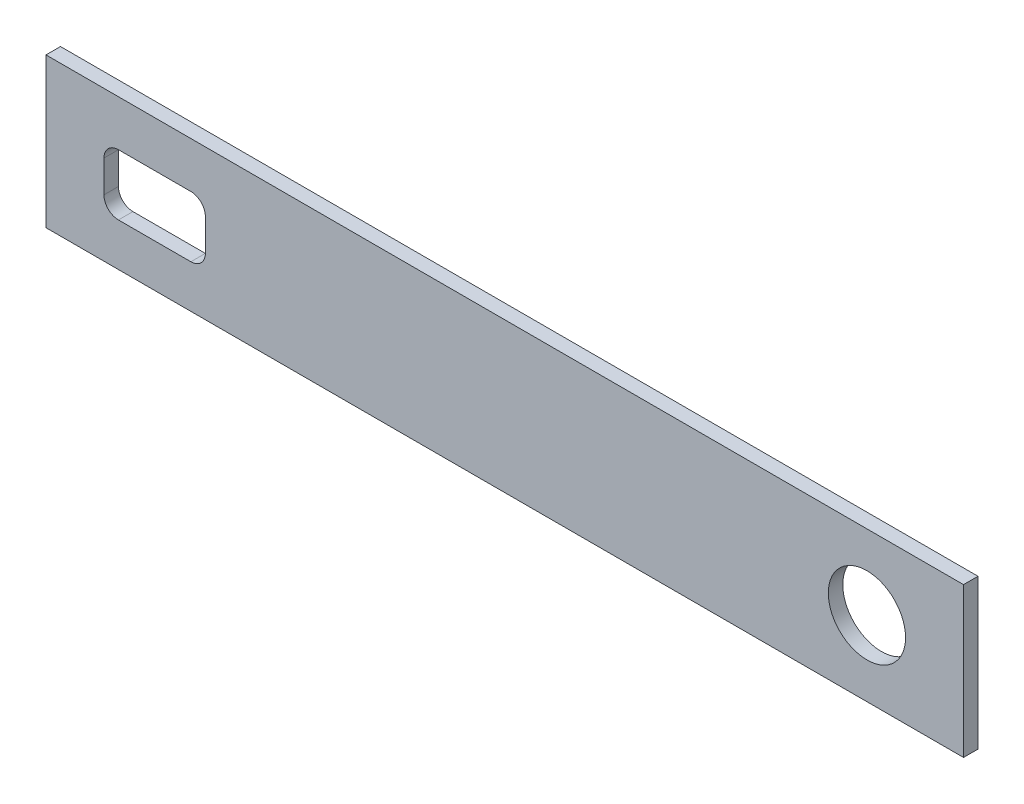
ISO-10303-21;
HEADER;
FILE_DESCRIPTION(('STEP AP214'),'2;1');
FILE_NAME('part.step','',(''),(''),'','','');
FILE_SCHEMA(('AUTOMOTIVE_DESIGN { 1 0 10303 214 1 1 1 1 }'));
ENDSEC;
DATA;
#1=APPLICATION_CONTEXT('core data for automotive mechanical design processes');
#2=APPLICATION_PROTOCOL_DEFINITION('international standard','automotive_design',2000,#1);
#3=PRODUCT_CONTEXT('',#1,'mechanical');
#4=PRODUCT('Part','Part','',(#3));
#5=PRODUCT_RELATED_PRODUCT_CATEGORY('part','',(#4));
#6=PRODUCT_DEFINITION_FORMATION('','',#4);
#7=PRODUCT_DEFINITION_CONTEXT('part definition',#1,'design');
#8=PRODUCT_DEFINITION('design','',#6,#7);
#9=PRODUCT_DEFINITION_SHAPE('','',#8);
#10=(LENGTH_UNIT() NAMED_UNIT(*) SI_UNIT(.MILLI.,.METRE.));
#11=(NAMED_UNIT(*) PLANE_ANGLE_UNIT() SI_UNIT($,.RADIAN.));
#12=(NAMED_UNIT(*) SI_UNIT($,.STERADIAN.) SOLID_ANGLE_UNIT());
#13=UNCERTAINTY_MEASURE_WITH_UNIT(LENGTH_MEASURE(1.E-05),#10,'distance_accuracy_value','');
#14=(GEOMETRIC_REPRESENTATION_CONTEXT(3) GLOBAL_UNCERTAINTY_ASSIGNED_CONTEXT((#13)) GLOBAL_UNIT_ASSIGNED_CONTEXT((#10,
#11,#12)) REPRESENTATION_CONTEXT('',''));
#15=CARTESIAN_POINT('',(0.,0.,0.));
#16=DIRECTION('',(0.,0.,1.));
#17=DIRECTION('',(1.,0.,0.));
#18=AXIS2_PLACEMENT_3D('',#15,#16,#17);
#19=CARTESIAN_POINT('',(0.,0.,-3.));
#20=DIRECTION('',(-1.,0.,0.));
#21=DIRECTION('',(0.,0.,1.));
#22=AXIS2_PLACEMENT_3D('',#19,#20,#21);
#23=PLANE('',#22);
#24=DIRECTION('',(0.,-1.,0.));
#25=VECTOR('',#24,1.);
#26=CARTESIAN_POINT('',(0.,0.,0.));
#27=LINE('',#26,#25);
#28=CARTESIAN_POINT('',(0.,31.,0.));
#29=VERTEX_POINT('',#28);
#30=CARTESIAN_POINT('',(0.,0.,0.));
#31=VERTEX_POINT('',#30);
#32=EDGE_CURVE('E196',#29,#31,#27,.T.);
#33=ORIENTED_EDGE('',*,*,#32,.F.);
#34=DIRECTION('',(0.,0.,1.));
#35=VECTOR('',#34,1.);
#36=CARTESIAN_POINT('',(0.,31.,-3.));
#37=LINE('',#36,#35);
#38=CARTESIAN_POINT('',(0.,31.,-3.));
#39=VERTEX_POINT('',#38);
#40=EDGE_CURVE('E11',#39,#29,#37,.T.);
#41=ORIENTED_EDGE('',*,*,#40,.F.);
#42=DIRECTION('',(0.,-1.,0.));
#43=VECTOR('',#42,1.);
#44=CARTESIAN_POINT('',(0.,0.,-3.));
#45=LINE('',#44,#43);
#46=CARTESIAN_POINT('',(0.,0.,-3.));
#47=VERTEX_POINT('',#46);
#48=EDGE_CURVE('E199',#39,#47,#45,.T.);
#49=ORIENTED_EDGE('',*,*,#48,.T.);
#50=DIRECTION('',(0.,0.,1.));
#51=VECTOR('',#50,1.);
#52=CARTESIAN_POINT('',(0.,0.,-3.));
#53=LINE('',#52,#51);
#54=EDGE_CURVE('E38',#47,#31,#53,.T.);
#55=ORIENTED_EDGE('',*,*,#54,.T.);
#56=EDGE_LOOP('',(#33,#41,#49,#55));
#57=FACE_BOUND('',#56,.T.);
#58=ADVANCED_FACE('F35',(#57),#23,.T.);
#59=CARTESIAN_POINT('',(0.,31.,-3.));
#60=DIRECTION('',(0.,1.,0.));
#61=DIRECTION('',(0.,0.,1.));
#62=AXIS2_PLACEMENT_3D('',#59,#60,#61);
#63=PLANE('',#62);
#64=DIRECTION('',(-1.,0.,0.));
#65=VECTOR('',#64,1.);
#66=CARTESIAN_POINT('',(0.,31.,0.));
#67=LINE('',#66,#65);
#68=CARTESIAN_POINT('',(190.,31.,0.));
#69=VERTEX_POINT('',#68);
#70=EDGE_CURVE('E203',#69,#29,#67,.T.);
#71=ORIENTED_EDGE('',*,*,#70,.F.);
#72=DIRECTION('',(0.,0.,1.));
#73=VECTOR('',#72,1.);
#74=CARTESIAN_POINT('',(190.,31.,-3.));
#75=LINE('',#74,#73);
#76=CARTESIAN_POINT('',(190.,31.,-3.));
#77=VERTEX_POINT('',#76);
#78=EDGE_CURVE('E43',#77,#69,#75,.T.);
#79=ORIENTED_EDGE('',*,*,#78,.F.);
#80=DIRECTION('',(-1.,0.,0.));
#81=VECTOR('',#80,1.);
#82=CARTESIAN_POINT('',(0.,31.,-3.));
#83=LINE('',#82,#81);
#84=EDGE_CURVE('E209',#77,#39,#83,.T.);
#85=ORIENTED_EDGE('',*,*,#84,.T.);
#86=ORIENTED_EDGE('',*,*,#40,.T.);
#87=EDGE_LOOP('',(#71,#79,#85,#86));
#88=FACE_BOUND('',#87,.T.);
#89=ADVANCED_FACE('F235',(#88),#63,.T.);
#90=CARTESIAN_POINT('',(190.,0.,-3.));
#91=DIRECTION('',(1.,0.,0.));
#92=DIRECTION('',(0.,0.,-1.));
#93=AXIS2_PLACEMENT_3D('',#90,#91,#92);
#94=PLANE('',#93);
#95=DIRECTION('',(0.,1.,0.));
#96=VECTOR('',#95,1.);
#97=CARTESIAN_POINT('',(190.,0.,0.));
#98=LINE('',#97,#96);
#99=CARTESIAN_POINT('',(190.,0.,0.));
#100=VERTEX_POINT('',#99);
#101=EDGE_CURVE('E217',#100,#69,#98,.T.);
#102=ORIENTED_EDGE('',*,*,#101,.F.);
#103=DIRECTION('',(0.,0.,1.));
#104=VECTOR('',#103,1.);
#105=CARTESIAN_POINT('',(190.,0.,-3.));
#106=LINE('',#105,#104);
#107=CARTESIAN_POINT('',(190.,0.,-3.));
#108=VERTEX_POINT('',#107);
#109=EDGE_CURVE('E222',#108,#100,#106,.T.);
#110=ORIENTED_EDGE('',*,*,#109,.F.);
#111=DIRECTION('',(0.,1.,0.));
#112=VECTOR('',#111,1.);
#113=CARTESIAN_POINT('',(190.,0.,-3.));
#114=LINE('',#113,#112);
#115=EDGE_CURVE('E206',#108,#77,#114,.T.);
#116=ORIENTED_EDGE('',*,*,#115,.T.);
#117=ORIENTED_EDGE('',*,*,#78,.T.);
#118=EDGE_LOOP('',(#102,#110,#116,#117));
#119=FACE_BOUND('',#118,.T.);
#120=ADVANCED_FACE('F240',(#119),#94,.T.);
#121=CARTESIAN_POINT('',(0.,0.,-3.));
#122=DIRECTION('',(0.,-1.,0.));
#123=DIRECTION('',(0.,0.,-1.));
#124=AXIS2_PLACEMENT_3D('',#121,#122,#123);
#125=PLANE('',#124);
#126=DIRECTION('',(1.,0.,0.));
#127=VECTOR('',#126,1.);
#128=CARTESIAN_POINT('',(0.,0.,0.));
#129=LINE('',#128,#127);
#130=EDGE_CURVE('E214',#31,#100,#129,.T.);
#131=ORIENTED_EDGE('',*,*,#130,.F.);
#132=ORIENTED_EDGE('',*,*,#54,.F.);
#133=DIRECTION('',(1.,0.,0.));
#134=VECTOR('',#133,1.);
#135=CARTESIAN_POINT('',(0.,0.,-3.));
#136=LINE('',#135,#134);
#137=EDGE_CURVE('E202',#47,#108,#136,.T.);
#138=ORIENTED_EDGE('',*,*,#137,.T.);
#139=ORIENTED_EDGE('',*,*,#109,.T.);
#140=EDGE_LOOP('',(#131,#132,#138,#139));
#141=FACE_BOUND('',#140,.T.);
#142=ADVANCED_FACE('F230',(#141),#125,.T.);
#143=CARTESIAN_POINT('',(0.,0.,-3.));
#144=DIRECTION('',(0.,0.,-1.));
#145=DIRECTION('',(-1.,0.,0.));
#146=AXIS2_PLACEMENT_3D('',#143,#144,#145);
#147=PLANE('',#146);
#148=CARTESIAN_POINT('',(30.,11.9,-3.));
#149=DIRECTION('',(0.,0.,1.));
#150=DIRECTION('',(1.,0.,0.));
#151=AXIS2_PLACEMENT_3D('',#148,#149,#150);
#152=CIRCLE('',#151,3.);
#153=CARTESIAN_POINT('',(30.,8.9,-3.));
#154=VERTEX_POINT('',#153);
#155=CARTESIAN_POINT('',(33.,11.9,-3.));
#156=VERTEX_POINT('',#155);
#157=EDGE_CURVE('E126',#154,#156,#152,.T.);
#158=ORIENTED_EDGE('',*,*,#157,.T.);
#159=DIRECTION('',(0.,1.,0.));
#160=VECTOR('',#159,1.);
#161=CARTESIAN_POINT('',(33.,18.5,-3.));
#162=LINE('',#161,#160);
#163=CARTESIAN_POINT('',(33.,18.5,-3.));
#164=VERTEX_POINT('',#163);
#165=EDGE_CURVE('E135',#156,#164,#162,.T.);
#166=ORIENTED_EDGE('',*,*,#165,.T.);
#167=CARTESIAN_POINT('',(30.,18.5,-3.));
#168=DIRECTION('',(0.,0.,1.));
#169=DIRECTION('',(-1.,0.,0.));
#170=AXIS2_PLACEMENT_3D('',#167,#168,#169);
#171=CIRCLE('',#170,3.);
#172=CARTESIAN_POINT('',(30.,21.5,-3.));
#173=VERTEX_POINT('',#172);
#174=EDGE_CURVE('E51',#164,#173,#171,.T.);
#175=ORIENTED_EDGE('',*,*,#174,.T.);
#176=DIRECTION('',(-1.,0.,0.));
#177=VECTOR('',#176,1.);
#178=CARTESIAN_POINT('',(15.,21.5,-3.));
#179=LINE('',#178,#177);
#180=CARTESIAN_POINT('',(15.,21.5,-3.));
#181=VERTEX_POINT('',#180);
#182=EDGE_CURVE('E150',#173,#181,#179,.T.);
#183=ORIENTED_EDGE('',*,*,#182,.T.);
#184=CARTESIAN_POINT('',(15.,18.5,-3.));
#185=DIRECTION('',(0.,0.,1.));
#186=DIRECTION('',(1.,0.,0.));
#187=AXIS2_PLACEMENT_3D('',#184,#185,#186);
#188=CIRCLE('',#187,3.);
#189=CARTESIAN_POINT('',(12.,18.5,-3.));
#190=VERTEX_POINT('',#189);
#191=EDGE_CURVE('E153',#181,#190,#188,.T.);
#192=ORIENTED_EDGE('',*,*,#191,.T.);
#193=DIRECTION('',(0.,-1.,0.));
#194=VECTOR('',#193,1.);
#195=CARTESIAN_POINT('',(12.,18.5,-3.));
#196=LINE('',#195,#194);
#197=CARTESIAN_POINT('',(12.,11.9,-3.));
#198=VERTEX_POINT('',#197);
#199=EDGE_CURVE('E156',#190,#198,#196,.T.);
#200=ORIENTED_EDGE('',*,*,#199,.T.);
#201=CARTESIAN_POINT('',(15.,11.9,-3.));
#202=DIRECTION('',(0.,0.,1.));
#203=DIRECTION('',(1.,0.,0.));
#204=AXIS2_PLACEMENT_3D('',#201,#202,#203);
#205=CIRCLE('',#204,3.);
#206=CARTESIAN_POINT('',(15.,8.9,-3.));
#207=VERTEX_POINT('',#206);
#208=EDGE_CURVE('E159',#198,#207,#205,.T.);
#209=ORIENTED_EDGE('',*,*,#208,.T.);
#210=DIRECTION('',(1.,0.,0.));
#211=VECTOR('',#210,1.);
#212=CARTESIAN_POINT('',(15.,8.9,-3.));
#213=LINE('',#212,#211);
#214=EDGE_CURVE('E132',#207,#154,#213,.T.);
#215=ORIENTED_EDGE('',*,*,#214,.T.);
#216=EDGE_LOOP('',(#158,#166,#175,#183,#192,#200,#209,#215));
#217=FACE_BOUND('',#216,.T.);
#218=CARTESIAN_POINT('',(170.,15.5,-3.));
#219=DIRECTION('',(0.,0.,1.));
#220=DIRECTION('',(1.,0.,0.));
#221=AXIS2_PLACEMENT_3D('',#218,#219,#220);
#222=CIRCLE('',#221,8.00000000000001);
#223=CARTESIAN_POINT('',(178.,15.5,-3.));
#224=VERTEX_POINT('',#223);
#225=EDGE_CURVE('E193',#224,#224,#222,.T.);
#226=ORIENTED_EDGE('',*,*,#225,.T.);
#227=EDGE_LOOP('',(#226));
#228=FACE_BOUND('',#227,.T.);
#229=ORIENTED_EDGE('',*,*,#48,.F.);
#230=ORIENTED_EDGE('',*,*,#84,.F.);
#231=ORIENTED_EDGE('',*,*,#115,.F.);
#232=ORIENTED_EDGE('',*,*,#137,.F.);
#233=EDGE_LOOP('',(#229,#230,#231,#232));
#234=FACE_BOUND('',#233,.T.);
#235=ADVANCED_FACE('F139',(#217,#228,#234),#147,.T.);
#236=CARTESIAN_POINT('',(0.,0.,0.));
#237=DIRECTION('',(0.,0.,-1.));
#238=DIRECTION('',(-1.,0.,0.));
#239=AXIS2_PLACEMENT_3D('',#236,#237,#238);
#240=PLANE('',#239);
#241=DIRECTION('',(0.,1.,0.));
#242=VECTOR('',#241,1.);
#243=CARTESIAN_POINT('',(33.,18.5,0.));
#244=LINE('',#243,#242);
#245=CARTESIAN_POINT('',(33.,11.9,0.));
#246=VERTEX_POINT('',#245);
#247=CARTESIAN_POINT('',(33.,18.5,0.));
#248=VERTEX_POINT('',#247);
#249=EDGE_CURVE('E163',#246,#248,#244,.T.);
#250=ORIENTED_EDGE('',*,*,#249,.F.);
#251=CARTESIAN_POINT('',(30.,11.9,0.));
#252=DIRECTION('',(0.,0.,1.));
#253=DIRECTION('',(1.,0.,0.));
#254=AXIS2_PLACEMENT_3D('',#251,#252,#253);
#255=CIRCLE('',#254,3.);
#256=CARTESIAN_POINT('',(30.,8.9,0.));
#257=VERTEX_POINT('',#256);
#258=EDGE_CURVE('E59',#257,#246,#255,.T.);
#259=ORIENTED_EDGE('',*,*,#258,.F.);
#260=DIRECTION('',(1.,0.,0.));
#261=VECTOR('',#260,1.);
#262=CARTESIAN_POINT('',(15.,8.9,0.));
#263=LINE('',#262,#261);
#264=CARTESIAN_POINT('',(15.,8.9,0.));
#265=VERTEX_POINT('',#264);
#266=EDGE_CURVE('E143',#265,#257,#263,.T.);
#267=ORIENTED_EDGE('',*,*,#266,.F.);
#268=CARTESIAN_POINT('',(15.,11.9,0.));
#269=DIRECTION('',(0.,0.,1.));
#270=DIRECTION('',(1.,0.,0.));
#271=AXIS2_PLACEMENT_3D('',#268,#269,#270);
#272=CIRCLE('',#271,3.);
#273=CARTESIAN_POINT('',(12.,11.9,0.));
#274=VERTEX_POINT('',#273);
#275=EDGE_CURVE('E146',#274,#265,#272,.T.);
#276=ORIENTED_EDGE('',*,*,#275,.F.);
#277=DIRECTION('',(0.,-1.,0.));
#278=VECTOR('',#277,1.);
#279=CARTESIAN_POINT('',(12.,18.5,0.));
#280=LINE('',#279,#278);
#281=CARTESIAN_POINT('',(12.,18.5,0.));
#282=VERTEX_POINT('',#281);
#283=EDGE_CURVE('E174',#282,#274,#280,.T.);
#284=ORIENTED_EDGE('',*,*,#283,.F.);
#285=CARTESIAN_POINT('',(15.,18.5,0.));
#286=DIRECTION('',(0.,0.,1.));
#287=DIRECTION('',(1.,0.,0.));
#288=AXIS2_PLACEMENT_3D('',#285,#286,#287);
#289=CIRCLE('',#288,3.);
#290=CARTESIAN_POINT('',(15.,21.5,0.));
#291=VERTEX_POINT('',#290);
#292=EDGE_CURVE('E171',#291,#282,#289,.T.);
#293=ORIENTED_EDGE('',*,*,#292,.F.);
#294=DIRECTION('',(-1.,0.,0.));
#295=VECTOR('',#294,1.);
#296=CARTESIAN_POINT('',(15.,21.5,0.));
#297=LINE('',#296,#295);
#298=CARTESIAN_POINT('',(30.,21.5,0.));
#299=VERTEX_POINT('',#298);
#300=EDGE_CURVE('E168',#299,#291,#297,.T.);
#301=ORIENTED_EDGE('',*,*,#300,.F.);
#302=CARTESIAN_POINT('',(30.,18.5,0.));
#303=DIRECTION('',(0.,0.,1.));
#304=DIRECTION('',(-1.,0.,0.));
#305=AXIS2_PLACEMENT_3D('',#302,#303,#304);
#306=CIRCLE('',#305,3.);
#307=EDGE_CURVE('E165',#248,#299,#306,.T.);
#308=ORIENTED_EDGE('',*,*,#307,.F.);
#309=EDGE_LOOP('',(#250,#259,#267,#276,#284,#293,#301,#308));
#310=FACE_BOUND('',#309,.T.);
#311=CARTESIAN_POINT('',(170.,15.5,0.));
#312=DIRECTION('',(0.,0.,1.));
#313=DIRECTION('',(1.,0.,0.));
#314=AXIS2_PLACEMENT_3D('',#311,#312,#313);
#315=CIRCLE('',#314,8.00000000000001);
#316=CARTESIAN_POINT('',(178.,15.5,0.));
#317=VERTEX_POINT('',#316);
#318=EDGE_CURVE('E181',#317,#317,#315,.T.);
#319=ORIENTED_EDGE('',*,*,#318,.F.);
#320=EDGE_LOOP('',(#319));
#321=FACE_BOUND('',#320,.T.);
#322=ORIENTED_EDGE('',*,*,#32,.T.);
#323=ORIENTED_EDGE('',*,*,#130,.T.);
#324=ORIENTED_EDGE('',*,*,#101,.T.);
#325=ORIENTED_EDGE('',*,*,#70,.T.);
#326=EDGE_LOOP('',(#322,#323,#324,#325));
#327=FACE_BOUND('',#326,.T.);
#328=ADVANCED_FACE('F232',(#310,#321,#327),#240,.F.);
#329=CARTESIAN_POINT('',(170.,15.5,-3.));
#330=DIRECTION('',(0.,0.,1.));
#331=DIRECTION('',(1.,0.,0.));
#332=AXIS2_PLACEMENT_3D('',#329,#330,#331);
#333=CYLINDRICAL_SURFACE('',#332,8.00000000000001);
#334=ORIENTED_EDGE('',*,*,#225,.F.);
#335=EDGE_LOOP('',(#334));
#336=FACE_BOUND('',#335,.T.);
#337=ORIENTED_EDGE('',*,*,#318,.T.);
#338=EDGE_LOOP('',(#337));
#339=FACE_BOUND('',#338,.T.);
#340=ADVANCED_FACE('F286',(#336,#339),#333,.F.);
#341=CARTESIAN_POINT('',(30.,11.9,-3.));
#342=DIRECTION('',(0.,0.,1.));
#343=DIRECTION('',(1.,0.,0.));
#344=AXIS2_PLACEMENT_3D('',#341,#342,#343);
#345=CYLINDRICAL_SURFACE('',#344,3.);
#346=ORIENTED_EDGE('',*,*,#258,.T.);
#347=DIRECTION('',(0.,0.,1.));
#348=VECTOR('',#347,1.);
#349=CARTESIAN_POINT('',(33.,11.9,-3.));
#350=LINE('',#349,#348);
#351=EDGE_CURVE('E122',#156,#246,#350,.T.);
#352=ORIENTED_EDGE('',*,*,#351,.F.);
#353=ORIENTED_EDGE('',*,*,#157,.F.);
#354=DIRECTION('',(0.,0.,1.));
#355=VECTOR('',#354,1.);
#356=CARTESIAN_POINT('',(30.,8.9,-3.));
#357=LINE('',#356,#355);
#358=EDGE_CURVE('E179',#154,#257,#357,.T.);
#359=ORIENTED_EDGE('',*,*,#358,.T.);
#360=EDGE_LOOP('',(#346,#352,#353,#359));
#361=FACE_BOUND('',#360,.T.);
#362=ADVANCED_FACE('F124',(#361),#345,.F.);
#363=CARTESIAN_POINT('',(15.,8.9,-3.));
#364=DIRECTION('',(0.,-1.,0.));
#365=DIRECTION('',(0.,0.,-1.));
#366=AXIS2_PLACEMENT_3D('',#363,#364,#365);
#367=PLANE('',#366);
#368=ORIENTED_EDGE('',*,*,#266,.T.);
#369=ORIENTED_EDGE('',*,*,#358,.F.);
#370=ORIENTED_EDGE('',*,*,#214,.F.);
#371=DIRECTION('',(0.,0.,1.));
#372=VECTOR('',#371,1.);
#373=CARTESIAN_POINT('',(15.,8.9,-3.));
#374=LINE('',#373,#372);
#375=EDGE_CURVE('E182',#207,#265,#374,.T.);
#376=ORIENTED_EDGE('',*,*,#375,.T.);
#377=EDGE_LOOP('',(#368,#369,#370,#376));
#378=FACE_BOUND('',#377,.T.);
#379=ADVANCED_FACE('F307',(#378),#367,.F.);
#380=CARTESIAN_POINT('',(15.,11.9,-3.));
#381=DIRECTION('',(0.,0.,1.));
#382=DIRECTION('',(1.,0.,0.));
#383=AXIS2_PLACEMENT_3D('',#380,#381,#382);
#384=CYLINDRICAL_SURFACE('',#383,3.);
#385=ORIENTED_EDGE('',*,*,#275,.T.);
#386=ORIENTED_EDGE('',*,*,#375,.F.);
#387=ORIENTED_EDGE('',*,*,#208,.F.);
#388=DIRECTION('',(0.,0.,1.));
#389=VECTOR('',#388,1.);
#390=CARTESIAN_POINT('',(12.,11.9,-3.));
#391=LINE('',#390,#389);
#392=EDGE_CURVE('E184',#198,#274,#391,.T.);
#393=ORIENTED_EDGE('',*,*,#392,.T.);
#394=EDGE_LOOP('',(#385,#386,#387,#393));
#395=FACE_BOUND('',#394,.T.);
#396=ADVANCED_FACE('F317',(#395),#384,.F.);
#397=CARTESIAN_POINT('',(12.,18.5,-3.));
#398=DIRECTION('',(-1.,0.,0.));
#399=DIRECTION('',(0.,-1.,0.));
#400=AXIS2_PLACEMENT_3D('',#397,#398,#399);
#401=PLANE('',#400);
#402=ORIENTED_EDGE('',*,*,#283,.T.);
#403=ORIENTED_EDGE('',*,*,#392,.F.);
#404=ORIENTED_EDGE('',*,*,#199,.F.);
#405=DIRECTION('',(0.,0.,1.));
#406=VECTOR('',#405,1.);
#407=CARTESIAN_POINT('',(12.,18.5,-3.));
#408=LINE('',#407,#406);
#409=EDGE_CURVE('E186',#190,#282,#408,.T.);
#410=ORIENTED_EDGE('',*,*,#409,.T.);
#411=EDGE_LOOP('',(#402,#403,#404,#410));
#412=FACE_BOUND('',#411,.T.);
#413=ADVANCED_FACE('F328',(#412),#401,.F.);
#414=CARTESIAN_POINT('',(15.,18.5,-3.));
#415=DIRECTION('',(0.,0.,1.));
#416=DIRECTION('',(1.,0.,0.));
#417=AXIS2_PLACEMENT_3D('',#414,#415,#416);
#418=CYLINDRICAL_SURFACE('',#417,3.);
#419=ORIENTED_EDGE('',*,*,#292,.T.);
#420=ORIENTED_EDGE('',*,*,#409,.F.);
#421=ORIENTED_EDGE('',*,*,#191,.F.);
#422=DIRECTION('',(0.,0.,1.));
#423=VECTOR('',#422,1.);
#424=CARTESIAN_POINT('',(15.,21.5,-3.));
#425=LINE('',#424,#423);
#426=EDGE_CURVE('E188',#181,#291,#425,.T.);
#427=ORIENTED_EDGE('',*,*,#426,.T.);
#428=EDGE_LOOP('',(#419,#420,#421,#427));
#429=FACE_BOUND('',#428,.T.);
#430=ADVANCED_FACE('F339',(#429),#418,.F.);
#431=CARTESIAN_POINT('',(15.,21.5,-3.));
#432=DIRECTION('',(0.,1.,0.));
#433=DIRECTION('',(0.,0.,1.));
#434=AXIS2_PLACEMENT_3D('',#431,#432,#433);
#435=PLANE('',#434);
#436=ORIENTED_EDGE('',*,*,#300,.T.);
#437=ORIENTED_EDGE('',*,*,#426,.F.);
#438=ORIENTED_EDGE('',*,*,#182,.F.);
#439=DIRECTION('',(0.,0.,1.));
#440=VECTOR('',#439,1.);
#441=CARTESIAN_POINT('',(30.,21.5,-3.));
#442=LINE('',#441,#440);
#443=EDGE_CURVE('E190',#173,#299,#442,.T.);
#444=ORIENTED_EDGE('',*,*,#443,.T.);
#445=EDGE_LOOP('',(#436,#437,#438,#444));
#446=FACE_BOUND('',#445,.T.);
#447=ADVANCED_FACE('F350',(#446),#435,.F.);
#448=CARTESIAN_POINT('',(30.,18.5,-3.));
#449=DIRECTION('',(0.,0.,1.));
#450=DIRECTION('',(1.,0.,0.));
#451=AXIS2_PLACEMENT_3D('',#448,#449,#450);
#452=CYLINDRICAL_SURFACE('',#451,3.);
#453=ORIENTED_EDGE('',*,*,#307,.T.);
#454=ORIENTED_EDGE('',*,*,#443,.F.);
#455=ORIENTED_EDGE('',*,*,#174,.F.);
#456=DIRECTION('',(0.,0.,1.));
#457=VECTOR('',#456,1.);
#458=CARTESIAN_POINT('',(33.,18.5,-3.));
#459=LINE('',#458,#457);
#460=EDGE_CURVE('E131',#164,#248,#459,.T.);
#461=ORIENTED_EDGE('',*,*,#460,.T.);
#462=EDGE_LOOP('',(#453,#454,#455,#461));
#463=FACE_BOUND('',#462,.T.);
#464=ADVANCED_FACE('F361',(#463),#452,.F.);
#465=CARTESIAN_POINT('',(33.,18.5,-3.));
#466=DIRECTION('',(1.,0.,0.));
#467=DIRECTION('',(0.,0.,-1.));
#468=AXIS2_PLACEMENT_3D('',#465,#466,#467);
#469=PLANE('',#468);
#470=ORIENTED_EDGE('',*,*,#249,.T.);
#471=ORIENTED_EDGE('',*,*,#460,.F.);
#472=ORIENTED_EDGE('',*,*,#165,.F.);
#473=ORIENTED_EDGE('',*,*,#351,.T.);
#474=EDGE_LOOP('',(#470,#471,#472,#473));
#475=FACE_BOUND('',#474,.T.);
#476=ADVANCED_FACE('F136',(#475),#469,.F.);
#477=CLOSED_SHELL('',(#58,#89,#120,#142,#235,#328,#340,#362,#379,#396,#413,#430,#447,#464,#476));
#478=MANIFOLD_SOLID_BREP('B2',#477);
#479=ADVANCED_BREP_SHAPE_REPRESENTATION('',(#18,#478),#14);
#480=SHAPE_DEFINITION_REPRESENTATION(#9,#479);
ENDSEC;
END-ISO-10303-21;
